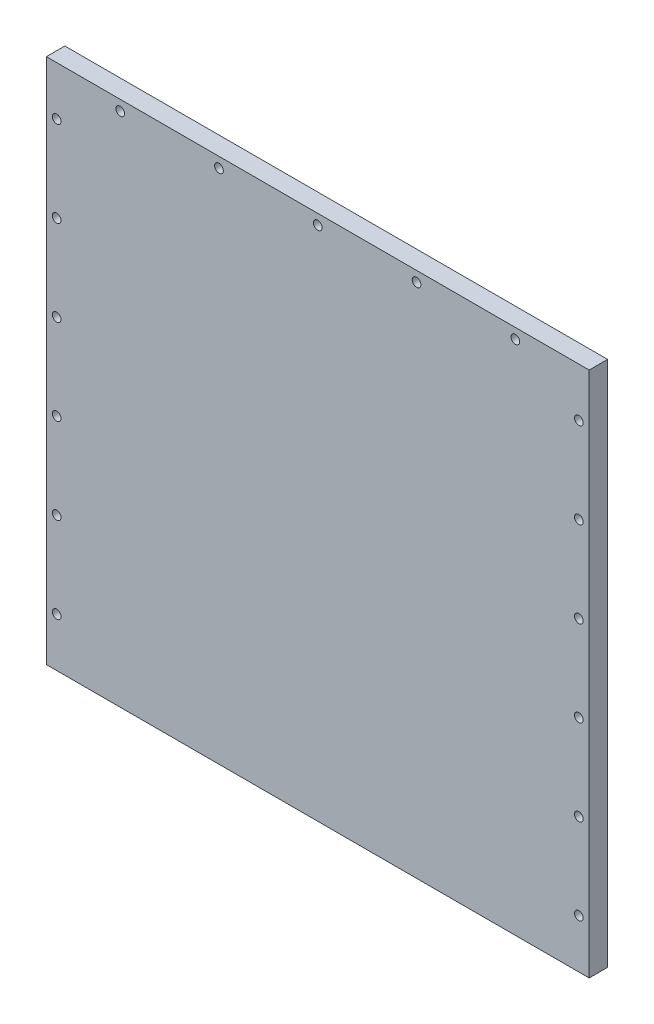
ISO-10303-21;
HEADER;
FILE_DESCRIPTION(('STEP AP214'),'2;1');
FILE_NAME('part.step','',(''),(''),'','','');
FILE_SCHEMA(('AUTOMOTIVE_DESIGN { 1 0 10303 214 1 1 1 1 }'));
ENDSEC;
DATA;
#1=APPLICATION_CONTEXT('core data for automotive mechanical design processes');
#2=APPLICATION_PROTOCOL_DEFINITION('international standard','automotive_design',2000,#1);
#3=PRODUCT_CONTEXT('',#1,'mechanical');
#4=PRODUCT('Part','Part','',(#3));
#5=PRODUCT_RELATED_PRODUCT_CATEGORY('part','',(#4));
#6=PRODUCT_DEFINITION_FORMATION('','',#4);
#7=PRODUCT_DEFINITION_CONTEXT('part definition',#1,'design');
#8=PRODUCT_DEFINITION('design','',#6,#7);
#9=PRODUCT_DEFINITION_SHAPE('','',#8);
#10=(LENGTH_UNIT() NAMED_UNIT(*) SI_UNIT(.MILLI.,.METRE.));
#11=(NAMED_UNIT(*) PLANE_ANGLE_UNIT() SI_UNIT($,.RADIAN.));
#12=(NAMED_UNIT(*) SI_UNIT($,.STERADIAN.) SOLID_ANGLE_UNIT());
#13=UNCERTAINTY_MEASURE_WITH_UNIT(LENGTH_MEASURE(1.E-05),#10,'distance_accuracy_value','');
#14=(GEOMETRIC_REPRESENTATION_CONTEXT(3) GLOBAL_UNCERTAINTY_ASSIGNED_CONTEXT((#13)) GLOBAL_UNIT_ASSIGNED_CONTEXT((#10,
#11,#12)) REPRESENTATION_CONTEXT('',''));
#15=CARTESIAN_POINT('',(0.,0.,0.));
#16=DIRECTION('',(0.,0.,1.));
#17=DIRECTION('',(1.,0.,0.));
#18=AXIS2_PLACEMENT_3D('',#15,#16,#17);
#19=CARTESIAN_POINT('',(0.,0.,17.));
#20=DIRECTION('',(0.,0.,1.));
#21=DIRECTION('',(1.,0.,0.));
#22=AXIS2_PLACEMENT_3D('',#19,#20,#21);
#23=PLANE('',#22);
#24=CARTESIAN_POINT('',(-91.,245.5,17.));
#25=DIRECTION('',(0.,0.,1.));
#26=DIRECTION('',(1.,0.,0.));
#27=AXIS2_PLACEMENT_3D('',#24,#25,#26);
#28=CIRCLE('',#27,3.99999999999999);
#29=CARTESIAN_POINT('',(-87.,245.5,17.));
#30=VERTEX_POINT('',#29);
#31=EDGE_CURVE('E167',#30,#30,#28,.F.);
#32=ORIENTED_EDGE('',*,*,#31,.T.);
#33=EDGE_LOOP('',(#32));
#34=FACE_BOUND('',#33,.T.);
#35=CARTESIAN_POINT('',(91.,245.5,17.));
#36=DIRECTION('',(0.,0.,1.));
#37=DIRECTION('',(1.,0.,0.));
#38=AXIS2_PLACEMENT_3D('',#35,#36,#37);
#39=CIRCLE('',#38,3.99999999999999);
#40=CARTESIAN_POINT('',(95.,245.5,17.));
#41=VERTEX_POINT('',#40);
#42=EDGE_CURVE('E160',#41,#41,#39,.F.);
#43=ORIENTED_EDGE('',*,*,#42,.T.);
#44=EDGE_LOOP('',(#43));
#45=FACE_BOUND('',#44,.T.);
#46=CARTESIAN_POINT('',(-182.,245.5,17.));
#47=DIRECTION('',(0.,0.,1.));
#48=DIRECTION('',(1.,0.,0.));
#49=AXIS2_PLACEMENT_3D('',#46,#47,#48);
#50=CIRCLE('',#49,3.99999999999999);
#51=CARTESIAN_POINT('',(-178.,245.5,17.));
#52=VERTEX_POINT('',#51);
#53=EDGE_CURVE('E152',#52,#52,#50,.F.);
#54=ORIENTED_EDGE('',*,*,#53,.T.);
#55=EDGE_LOOP('',(#54));
#56=FACE_BOUND('',#55,.T.);
#57=CARTESIAN_POINT('',(240.5,-106.,17.));
#58=DIRECTION('',(0.,0.,1.));
#59=DIRECTION('',(1.,0.,0.));
#60=AXIS2_PLACEMENT_3D('',#57,#58,#59);
#61=CIRCLE('',#60,3.99999999999999);
#62=CARTESIAN_POINT('',(244.5,-106.,17.));
#63=VERTEX_POINT('',#62);
#64=EDGE_CURVE('E144',#63,#63,#61,.F.);
#65=ORIENTED_EDGE('',*,*,#64,.T.);
#66=EDGE_LOOP('',(#65));
#67=FACE_BOUND('',#66,.T.);
#68=CARTESIAN_POINT('',(240.5,-27.,17.));
#69=DIRECTION('',(0.,0.,1.));
#70=DIRECTION('',(1.,0.,0.));
#71=AXIS2_PLACEMENT_3D('',#68,#69,#70);
#72=CIRCLE('',#71,3.99999999999999);
#73=CARTESIAN_POINT('',(244.5,-27.,17.));
#74=VERTEX_POINT('',#73);
#75=EDGE_CURVE('E136',#74,#74,#72,.F.);
#76=ORIENTED_EDGE('',*,*,#75,.T.);
#77=EDGE_LOOP('',(#76));
#78=FACE_BOUND('',#77,.T.);
#79=CARTESIAN_POINT('',(240.5,52.,17.));
#80=DIRECTION('',(0.,0.,1.));
#81=DIRECTION('',(1.,0.,0.));
#82=AXIS2_PLACEMENT_3D('',#79,#80,#81);
#83=CIRCLE('',#82,3.99999999999999);
#84=CARTESIAN_POINT('',(244.5,52.,17.));
#85=VERTEX_POINT('',#84);
#86=EDGE_CURVE('E128',#85,#85,#83,.F.);
#87=ORIENTED_EDGE('',*,*,#86,.T.);
#88=EDGE_LOOP('',(#87));
#89=FACE_BOUND('',#88,.T.);
#90=CARTESIAN_POINT('',(240.5,131.,17.));
#91=DIRECTION('',(0.,0.,1.));
#92=DIRECTION('',(1.,0.,0.));
#93=AXIS2_PLACEMENT_3D('',#90,#91,#92);
#94=CIRCLE('',#93,3.99999999999999);
#95=CARTESIAN_POINT('',(244.5,131.,17.));
#96=VERTEX_POINT('',#95);
#97=EDGE_CURVE('E120',#96,#96,#94,.F.);
#98=ORIENTED_EDGE('',*,*,#97,.T.);
#99=EDGE_LOOP('',(#98));
#100=FACE_BOUND('',#99,.T.);
#101=CARTESIAN_POINT('',(182.,245.5,17.));
#102=DIRECTION('',(0.,0.,1.));
#103=DIRECTION('',(1.,0.,0.));
#104=AXIS2_PLACEMENT_3D('',#101,#102,#103);
#105=CIRCLE('',#104,3.99999999999999);
#106=CARTESIAN_POINT('',(186.,245.5,17.));
#107=VERTEX_POINT('',#106);
#108=EDGE_CURVE('E112',#107,#107,#105,.F.);
#109=ORIENTED_EDGE('',*,*,#108,.T.);
#110=EDGE_LOOP('',(#109));
#111=FACE_BOUND('',#110,.T.);
#112=DIRECTION('',(0.,-1.,0.));
#113=VECTOR('',#112,1.);
#114=CARTESIAN_POINT('',(-250.,255.,17.));
#115=LINE('',#114,#113);
#116=CARTESIAN_POINT('',(-250.,255.,17.));
#117=VERTEX_POINT('',#116);
#118=CARTESIAN_POINT('',(-250.,-230.,17.));
#119=VERTEX_POINT('',#118);
#120=EDGE_CURVE('E87',#117,#119,#115,.T.);
#121=ORIENTED_EDGE('',*,*,#120,.T.);
#122=DIRECTION('',(1.,0.,0.));
#123=VECTOR('',#122,1.);
#124=CARTESIAN_POINT('',(-250.,-230.,17.));
#125=LINE('',#124,#123);
#126=CARTESIAN_POINT('',(250.,-230.,17.));
#127=VERTEX_POINT('',#126);
#128=EDGE_CURVE('E82',#119,#127,#125,.T.);
#129=ORIENTED_EDGE('',*,*,#128,.T.);
#130=DIRECTION('',(0.,1.,0.));
#131=VECTOR('',#130,1.);
#132=CARTESIAN_POINT('',(250.,255.,17.));
#133=LINE('',#132,#131);
#134=CARTESIAN_POINT('',(250.,255.,17.));
#135=VERTEX_POINT('',#134);
#136=EDGE_CURVE('E85',#127,#135,#133,.T.);
#137=ORIENTED_EDGE('',*,*,#136,.T.);
#138=DIRECTION('',(-1.,0.,0.));
#139=VECTOR('',#138,1.);
#140=CARTESIAN_POINT('',(-250.,255.,17.));
#141=LINE('',#140,#139);
#142=EDGE_CURVE('E52',#135,#117,#141,.T.);
#143=ORIENTED_EDGE('',*,*,#142,.T.);
#144=EDGE_LOOP('',(#121,#129,#137,#143));
#145=FACE_BOUND('',#144,.T.);
#146=CARTESIAN_POINT('',(240.5,210.,17.));
#147=DIRECTION('',(0.,0.,1.));
#148=DIRECTION('',(1.,0.,0.));
#149=AXIS2_PLACEMENT_3D('',#146,#147,#148);
#150=CIRCLE('',#149,3.99999999999999);
#151=CARTESIAN_POINT('',(244.5,210.,17.));
#152=VERTEX_POINT('',#151);
#153=EDGE_CURVE('E103',#152,#152,#150,.F.);
#154=ORIENTED_EDGE('',*,*,#153,.T.);
#155=EDGE_LOOP('',(#154));
#156=FACE_BOUND('',#155,.T.);
#157=CARTESIAN_POINT('',(-240.5,210.,17.));
#158=DIRECTION('',(0.,0.,1.));
#159=DIRECTION('',(1.,0.,0.));
#160=AXIS2_PLACEMENT_3D('',#157,#158,#159);
#161=CIRCLE('',#160,3.99999999999999);
#162=CARTESIAN_POINT('',(-236.5,210.,17.));
#163=VERTEX_POINT('',#162);
#164=EDGE_CURVE('E116',#163,#163,#161,.F.);
#165=ORIENTED_EDGE('',*,*,#164,.T.);
#166=EDGE_LOOP('',(#165));
#167=FACE_BOUND('',#166,.T.);
#168=CARTESIAN_POINT('',(-240.5,131.,17.));
#169=DIRECTION('',(0.,0.,1.));
#170=DIRECTION('',(1.,0.,0.));
#171=AXIS2_PLACEMENT_3D('',#168,#169,#170);
#172=CIRCLE('',#171,3.99999999999993);
#173=CARTESIAN_POINT('',(-236.5,131.,17.));
#174=VERTEX_POINT('',#173);
#175=EDGE_CURVE('E124',#174,#174,#172,.F.);
#176=ORIENTED_EDGE('',*,*,#175,.T.);
#177=EDGE_LOOP('',(#176));
#178=FACE_BOUND('',#177,.T.);
#179=CARTESIAN_POINT('',(-240.5,52.,17.));
#180=DIRECTION('',(0.,0.,1.));
#181=DIRECTION('',(1.,0.,0.));
#182=AXIS2_PLACEMENT_3D('',#179,#180,#181);
#183=CIRCLE('',#182,3.99999999999999);
#184=CARTESIAN_POINT('',(-236.5,52.,17.));
#185=VERTEX_POINT('',#184);
#186=EDGE_CURVE('E132',#185,#185,#183,.F.);
#187=ORIENTED_EDGE('',*,*,#186,.T.);
#188=EDGE_LOOP('',(#187));
#189=FACE_BOUND('',#188,.T.);
#190=CARTESIAN_POINT('',(-240.5,-27.,17.));
#191=DIRECTION('',(0.,0.,1.));
#192=DIRECTION('',(1.,0.,0.));
#193=AXIS2_PLACEMENT_3D('',#190,#191,#192);
#194=CIRCLE('',#193,3.99999999999999);
#195=CARTESIAN_POINT('',(-236.5,-27.,17.));
#196=VERTEX_POINT('',#195);
#197=EDGE_CURVE('E140',#196,#196,#194,.F.);
#198=ORIENTED_EDGE('',*,*,#197,.T.);
#199=EDGE_LOOP('',(#198));
#200=FACE_BOUND('',#199,.T.);
#201=CARTESIAN_POINT('',(-240.5,-106.,17.));
#202=DIRECTION('',(0.,0.,1.));
#203=DIRECTION('',(1.,0.,0.));
#204=AXIS2_PLACEMENT_3D('',#201,#202,#203);
#205=CIRCLE('',#204,3.99999999999999);
#206=CARTESIAN_POINT('',(-236.5,-106.,17.));
#207=VERTEX_POINT('',#206);
#208=EDGE_CURVE('E148',#207,#207,#205,.F.);
#209=ORIENTED_EDGE('',*,*,#208,.T.);
#210=EDGE_LOOP('',(#209));
#211=FACE_BOUND('',#210,.T.);
#212=CARTESIAN_POINT('',(240.5,-185.,17.));
#213=DIRECTION('',(0.,0.,1.));
#214=DIRECTION('',(1.,0.,0.));
#215=AXIS2_PLACEMENT_3D('',#212,#213,#214);
#216=CIRCLE('',#215,3.99999999999999);
#217=CARTESIAN_POINT('',(244.5,-185.,17.));
#218=VERTEX_POINT('',#217);
#219=EDGE_CURVE('E156',#218,#218,#216,.F.);
#220=ORIENTED_EDGE('',*,*,#219,.T.);
#221=EDGE_LOOP('',(#220));
#222=FACE_BOUND('',#221,.T.);
#223=CARTESIAN_POINT('',(0.,245.5,17.));
#224=DIRECTION('',(0.,0.,1.));
#225=DIRECTION('',(1.,0.,0.));
#226=AXIS2_PLACEMENT_3D('',#223,#224,#225);
#227=CIRCLE('',#226,4.00000000000001);
#228=CARTESIAN_POINT('',(4.00000000000001,245.5,17.));
#229=VERTEX_POINT('',#228);
#230=EDGE_CURVE('E164',#229,#229,#227,.F.);
#231=ORIENTED_EDGE('',*,*,#230,.T.);
#232=EDGE_LOOP('',(#231));
#233=FACE_BOUND('',#232,.T.);
#234=CARTESIAN_POINT('',(-240.5,-185.,17.));
#235=DIRECTION('',(0.,0.,1.));
#236=DIRECTION('',(1.,0.,0.));
#237=AXIS2_PLACEMENT_3D('',#234,#235,#236);
#238=CIRCLE('',#237,3.99999999999999);
#239=CARTESIAN_POINT('',(-236.5,-185.,17.));
#240=VERTEX_POINT('',#239);
#241=EDGE_CURVE('E37',#240,#240,#238,.F.);
#242=ORIENTED_EDGE('',*,*,#241,.T.);
#243=EDGE_LOOP('',(#242));
#244=FACE_BOUND('',#243,.T.);
#245=ADVANCED_FACE('F33',(#34,#45,#56,#67,#78,#89,#100,#111,#145,#156,#167,#178,#189,#200,#211,
#222,#233,#244),#23,.T.);
#246=CARTESIAN_POINT('',(-250.,255.,17.));
#247=DIRECTION('',(1.,0.,0.));
#248=DIRECTION('',(0.,1.,0.));
#249=AXIS2_PLACEMENT_3D('',#246,#247,#248);
#250=PLANE('',#249);
#251=DIRECTION('',(0.,-1.,0.));
#252=VECTOR('',#251,1.);
#253=CARTESIAN_POINT('',(-250.,255.,0.));
#254=LINE('',#253,#252);
#255=CARTESIAN_POINT('',(-250.,255.,0.));
#256=VERTEX_POINT('',#255);
#257=CARTESIAN_POINT('',(-250.,-230.,0.));
#258=VERTEX_POINT('',#257);
#259=EDGE_CURVE('E100',#256,#258,#254,.T.);
#260=ORIENTED_EDGE('',*,*,#259,.T.);
#261=DIRECTION('',(0.,0.,-1.));
#262=VECTOR('',#261,1.);
#263=CARTESIAN_POINT('',(-250.,-230.,17.));
#264=LINE('',#263,#262);
#265=EDGE_CURVE('E11',#119,#258,#264,.T.);
#266=ORIENTED_EDGE('',*,*,#265,.F.);
#267=ORIENTED_EDGE('',*,*,#120,.F.);
#268=DIRECTION('',(0.,0.,-1.));
#269=VECTOR('',#268,1.);
#270=CARTESIAN_POINT('',(-250.,255.,17.));
#271=LINE('',#270,#269);
#272=EDGE_CURVE('E96',#117,#256,#271,.T.);
#273=ORIENTED_EDGE('',*,*,#272,.T.);
#274=EDGE_LOOP('',(#260,#266,#267,#273));
#275=FACE_BOUND('',#274,.T.);
#276=ADVANCED_FACE('F35',(#275),#250,.F.);
#277=CARTESIAN_POINT('',(-250.,-230.,17.));
#278=DIRECTION('',(0.,1.,0.));
#279=DIRECTION('',(0.,0.,1.));
#280=AXIS2_PLACEMENT_3D('',#277,#278,#279);
#281=PLANE('',#280);
#282=DIRECTION('',(1.,0.,0.));
#283=VECTOR('',#282,1.);
#284=CARTESIAN_POINT('',(-250.,-230.,0.));
#285=LINE('',#284,#283);
#286=CARTESIAN_POINT('',(250.,-230.,0.));
#287=VERTEX_POINT('',#286);
#288=EDGE_CURVE('E91',#258,#287,#285,.T.);
#289=ORIENTED_EDGE('',*,*,#288,.T.);
#290=DIRECTION('',(0.,0.,-1.));
#291=VECTOR('',#290,1.);
#292=CARTESIAN_POINT('',(250.,-230.,17.));
#293=LINE('',#292,#291);
#294=EDGE_CURVE('E43',#127,#287,#293,.T.);
#295=ORIENTED_EDGE('',*,*,#294,.F.);
#296=ORIENTED_EDGE('',*,*,#128,.F.);
#297=ORIENTED_EDGE('',*,*,#265,.T.);
#298=EDGE_LOOP('',(#289,#295,#296,#297));
#299=FACE_BOUND('',#298,.T.);
#300=ADVANCED_FACE('F90',(#299),#281,.F.);
#301=CARTESIAN_POINT('',(250.,255.,17.));
#302=DIRECTION('',(-1.,0.,0.));
#303=DIRECTION('',(0.,0.,1.));
#304=AXIS2_PLACEMENT_3D('',#301,#302,#303);
#305=PLANE('',#304);
#306=DIRECTION('',(0.,1.,0.));
#307=VECTOR('',#306,1.);
#308=CARTESIAN_POINT('',(250.,255.,0.));
#309=LINE('',#308,#307);
#310=CARTESIAN_POINT('',(250.,255.,0.));
#311=VERTEX_POINT('',#310);
#312=EDGE_CURVE('E69',#287,#311,#309,.T.);
#313=ORIENTED_EDGE('',*,*,#312,.T.);
#314=DIRECTION('',(0.,0.,-1.));
#315=VECTOR('',#314,1.);
#316=CARTESIAN_POINT('',(250.,255.,17.));
#317=LINE('',#316,#315);
#318=EDGE_CURVE('E92',#135,#311,#317,.T.);
#319=ORIENTED_EDGE('',*,*,#318,.F.);
#320=ORIENTED_EDGE('',*,*,#136,.F.);
#321=ORIENTED_EDGE('',*,*,#294,.T.);
#322=EDGE_LOOP('',(#313,#319,#320,#321));
#323=FACE_BOUND('',#322,.T.);
#324=ADVANCED_FACE('F94',(#323),#305,.F.);
#325=CARTESIAN_POINT('',(-250.,255.,17.));
#326=DIRECTION('',(0.,-1.,0.));
#327=DIRECTION('',(0.,0.,-1.));
#328=AXIS2_PLACEMENT_3D('',#325,#326,#327);
#329=PLANE('',#328);
#330=DIRECTION('',(-1.,0.,0.));
#331=VECTOR('',#330,1.);
#332=CARTESIAN_POINT('',(-250.,255.,0.));
#333=LINE('',#332,#331);
#334=EDGE_CURVE('E75',#311,#256,#333,.T.);
#335=ORIENTED_EDGE('',*,*,#334,.T.);
#336=ORIENTED_EDGE('',*,*,#272,.F.);
#337=ORIENTED_EDGE('',*,*,#142,.F.);
#338=ORIENTED_EDGE('',*,*,#318,.T.);
#339=EDGE_LOOP('',(#335,#336,#337,#338));
#340=FACE_BOUND('',#339,.T.);
#341=ADVANCED_FACE('F224',(#340),#329,.F.);
#342=CARTESIAN_POINT('',(0.,0.,0.));
#343=DIRECTION('',(0.,0.,1.));
#344=DIRECTION('',(1.,0.,0.));
#345=AXIS2_PLACEMENT_3D('',#342,#343,#344);
#346=PLANE('',#345);
#347=ORIENTED_EDGE('',*,*,#259,.F.);
#348=ORIENTED_EDGE('',*,*,#334,.F.);
#349=ORIENTED_EDGE('',*,*,#312,.F.);
#350=ORIENTED_EDGE('',*,*,#288,.F.);
#351=EDGE_LOOP('',(#347,#348,#349,#350));
#352=FACE_BOUND('',#351,.T.);
#353=ADVANCED_FACE('F215',(#352),#346,.F.);
#354=CARTESIAN_POINT('',(240.5,210.,42.));
#355=DIRECTION('',(0.,0.,-1.));
#356=DIRECTION('',(-1.,0.,0.));
#357=AXIS2_PLACEMENT_3D('',#354,#355,#356);
#358=CYLINDRICAL_SURFACE('',#357,3.99999999999999);
#359=ORIENTED_EDGE('',*,*,#153,.F.);
#360=EDGE_LOOP('',(#359));
#361=FACE_BOUND('',#360,.T.);
#362=CARTESIAN_POINT('',(240.5,210.,4.));
#363=DIRECTION('',(0.,0.,1.));
#364=DIRECTION('',(1.,0.,0.));
#365=AXIS2_PLACEMENT_3D('',#362,#363,#364);
#366=CIRCLE('',#365,3.99999999999999);
#367=CARTESIAN_POINT('',(244.5,210.,4.));
#368=VERTEX_POINT('',#367);
#369=EDGE_CURVE('E111',#368,#368,#366,.T.);
#370=ORIENTED_EDGE('',*,*,#369,.F.);
#371=EDGE_LOOP('',(#370));
#372=FACE_BOUND('',#371,.T.);
#373=ADVANCED_FACE('F213',(#361,#372),#358,.F.);
#374=CARTESIAN_POINT('',(240.5,210.,4.));
#375=DIRECTION('',(0.,0.,1.));
#376=DIRECTION('',(1.,0.,0.));
#377=AXIS2_PLACEMENT_3D('',#374,#375,#376);
#378=PLANE('',#377);
#379=ORIENTED_EDGE('',*,*,#369,.T.);
#380=EDGE_LOOP('',(#379));
#381=FACE_BOUND('',#380,.T.);
#382=ADVANCED_FACE('F211',(#381),#378,.T.);
#383=CARTESIAN_POINT('',(182.,245.5,42.));
#384=DIRECTION('',(0.,0.,-1.));
#385=DIRECTION('',(-1.,0.,0.));
#386=AXIS2_PLACEMENT_3D('',#383,#384,#385);
#387=CYLINDRICAL_SURFACE('',#386,3.99999999999999);
#388=ORIENTED_EDGE('',*,*,#108,.F.);
#389=EDGE_LOOP('',(#388));
#390=FACE_BOUND('',#389,.T.);
#391=CARTESIAN_POINT('',(182.,245.5,4.));
#392=DIRECTION('',(0.,0.,1.));
#393=DIRECTION('',(1.,0.,0.));
#394=AXIS2_PLACEMENT_3D('',#391,#392,#393);
#395=CIRCLE('',#394,3.99999999999999);
#396=CARTESIAN_POINT('',(186.,245.5,4.));
#397=VERTEX_POINT('',#396);
#398=EDGE_CURVE('E115',#397,#397,#395,.T.);
#399=ORIENTED_EDGE('',*,*,#398,.F.);
#400=EDGE_LOOP('',(#399));
#401=FACE_BOUND('',#400,.T.);
#402=ADVANCED_FACE('F222',(#390,#401),#387,.F.);
#403=CARTESIAN_POINT('',(182.,245.5,4.));
#404=DIRECTION('',(0.,0.,1.));
#405=DIRECTION('',(1.,0.,0.));
#406=AXIS2_PLACEMENT_3D('',#403,#404,#405);
#407=PLANE('',#406);
#408=ORIENTED_EDGE('',*,*,#398,.T.);
#409=EDGE_LOOP('',(#408));
#410=FACE_BOUND('',#409,.T.);
#411=ADVANCED_FACE('F279',(#410),#407,.T.);
#412=CARTESIAN_POINT('',(-240.5,210.,42.));
#413=DIRECTION('',(0.,0.,-1.));
#414=DIRECTION('',(-1.,0.,0.));
#415=AXIS2_PLACEMENT_3D('',#412,#413,#414);
#416=CYLINDRICAL_SURFACE('',#415,3.99999999999999);
#417=ORIENTED_EDGE('',*,*,#164,.F.);
#418=EDGE_LOOP('',(#417));
#419=FACE_BOUND('',#418,.T.);
#420=CARTESIAN_POINT('',(-240.5,210.,4.));
#421=DIRECTION('',(0.,0.,1.));
#422=DIRECTION('',(1.,0.,0.));
#423=AXIS2_PLACEMENT_3D('',#420,#421,#422);
#424=CIRCLE('',#423,3.99999999999999);
#425=CARTESIAN_POINT('',(-236.5,210.,4.));
#426=VERTEX_POINT('',#425);
#427=EDGE_CURVE('E119',#426,#426,#424,.T.);
#428=ORIENTED_EDGE('',*,*,#427,.F.);
#429=EDGE_LOOP('',(#428));
#430=FACE_BOUND('',#429,.T.);
#431=ADVANCED_FACE('F289',(#419,#430),#416,.F.);
#432=CARTESIAN_POINT('',(-240.5,210.,4.));
#433=DIRECTION('',(0.,0.,1.));
#434=DIRECTION('',(1.,0.,0.));
#435=AXIS2_PLACEMENT_3D('',#432,#433,#434);
#436=PLANE('',#435);
#437=ORIENTED_EDGE('',*,*,#427,.T.);
#438=EDGE_LOOP('',(#437));
#439=FACE_BOUND('',#438,.T.);
#440=ADVANCED_FACE('F299',(#439),#436,.T.);
#441=CARTESIAN_POINT('',(240.5,131.,42.));
#442=DIRECTION('',(0.,0.,-1.));
#443=DIRECTION('',(-1.,0.,0.));
#444=AXIS2_PLACEMENT_3D('',#441,#442,#443);
#445=CYLINDRICAL_SURFACE('',#444,3.99999999999999);
#446=ORIENTED_EDGE('',*,*,#97,.F.);
#447=EDGE_LOOP('',(#446));
#448=FACE_BOUND('',#447,.T.);
#449=CARTESIAN_POINT('',(240.5,131.,4.));
#450=DIRECTION('',(0.,0.,1.));
#451=DIRECTION('',(1.,0.,0.));
#452=AXIS2_PLACEMENT_3D('',#449,#450,#451);
#453=CIRCLE('',#452,3.99999999999999);
#454=CARTESIAN_POINT('',(244.5,131.,4.));
#455=VERTEX_POINT('',#454);
#456=EDGE_CURVE('E123',#455,#455,#453,.T.);
#457=ORIENTED_EDGE('',*,*,#456,.F.);
#458=EDGE_LOOP('',(#457));
#459=FACE_BOUND('',#458,.T.);
#460=ADVANCED_FACE('F309',(#448,#459),#445,.F.);
#461=CARTESIAN_POINT('',(240.5,131.,4.));
#462=DIRECTION('',(0.,0.,1.));
#463=DIRECTION('',(1.,0.,0.));
#464=AXIS2_PLACEMENT_3D('',#461,#462,#463);
#465=PLANE('',#464);
#466=ORIENTED_EDGE('',*,*,#456,.T.);
#467=EDGE_LOOP('',(#466));
#468=FACE_BOUND('',#467,.T.);
#469=ADVANCED_FACE('F319',(#468),#465,.T.);
#470=CARTESIAN_POINT('',(-240.5,131.,42.));
#471=DIRECTION('',(0.,0.,-1.));
#472=DIRECTION('',(-1.,0.,0.));
#473=AXIS2_PLACEMENT_3D('',#470,#471,#472);
#474=CYLINDRICAL_SURFACE('',#473,3.99999999999993);
#475=ORIENTED_EDGE('',*,*,#175,.F.);
#476=EDGE_LOOP('',(#475));
#477=FACE_BOUND('',#476,.T.);
#478=CARTESIAN_POINT('',(-240.5,131.,4.));
#479=DIRECTION('',(0.,0.,1.));
#480=DIRECTION('',(1.,0.,0.));
#481=AXIS2_PLACEMENT_3D('',#478,#479,#480);
#482=CIRCLE('',#481,3.99999999999993);
#483=CARTESIAN_POINT('',(-236.5,131.,4.));
#484=VERTEX_POINT('',#483);
#485=EDGE_CURVE('E127',#484,#484,#482,.T.);
#486=ORIENTED_EDGE('',*,*,#485,.F.);
#487=EDGE_LOOP('',(#486));
#488=FACE_BOUND('',#487,.T.);
#489=ADVANCED_FACE('F329',(#477,#488),#474,.F.);
#490=CARTESIAN_POINT('',(-240.5,131.,4.));
#491=DIRECTION('',(0.,0.,1.));
#492=DIRECTION('',(1.,0.,0.));
#493=AXIS2_PLACEMENT_3D('',#490,#491,#492);
#494=PLANE('',#493);
#495=ORIENTED_EDGE('',*,*,#485,.T.);
#496=EDGE_LOOP('',(#495));
#497=FACE_BOUND('',#496,.T.);
#498=ADVANCED_FACE('F339',(#497),#494,.T.);
#499=CARTESIAN_POINT('',(240.5,52.,42.));
#500=DIRECTION('',(0.,0.,-1.));
#501=DIRECTION('',(-1.,0.,0.));
#502=AXIS2_PLACEMENT_3D('',#499,#500,#501);
#503=CYLINDRICAL_SURFACE('',#502,3.99999999999999);
#504=ORIENTED_EDGE('',*,*,#86,.F.);
#505=EDGE_LOOP('',(#504));
#506=FACE_BOUND('',#505,.T.);
#507=CARTESIAN_POINT('',(240.5,52.,4.));
#508=DIRECTION('',(0.,0.,1.));
#509=DIRECTION('',(1.,0.,0.));
#510=AXIS2_PLACEMENT_3D('',#507,#508,#509);
#511=CIRCLE('',#510,3.99999999999999);
#512=CARTESIAN_POINT('',(244.5,52.,4.));
#513=VERTEX_POINT('',#512);
#514=EDGE_CURVE('E131',#513,#513,#511,.T.);
#515=ORIENTED_EDGE('',*,*,#514,.F.);
#516=EDGE_LOOP('',(#515));
#517=FACE_BOUND('',#516,.T.);
#518=ADVANCED_FACE('F349',(#506,#517),#503,.F.);
#519=CARTESIAN_POINT('',(240.5,52.,4.));
#520=DIRECTION('',(0.,0.,1.));
#521=DIRECTION('',(1.,0.,0.));
#522=AXIS2_PLACEMENT_3D('',#519,#520,#521);
#523=PLANE('',#522);
#524=ORIENTED_EDGE('',*,*,#514,.T.);
#525=EDGE_LOOP('',(#524));
#526=FACE_BOUND('',#525,.T.);
#527=ADVANCED_FACE('F359',(#526),#523,.T.);
#528=CARTESIAN_POINT('',(-240.5,52.,42.));
#529=DIRECTION('',(0.,0.,-1.));
#530=DIRECTION('',(-1.,0.,0.));
#531=AXIS2_PLACEMENT_3D('',#528,#529,#530);
#532=CYLINDRICAL_SURFACE('',#531,3.99999999999999);
#533=ORIENTED_EDGE('',*,*,#186,.F.);
#534=EDGE_LOOP('',(#533));
#535=FACE_BOUND('',#534,.T.);
#536=CARTESIAN_POINT('',(-240.5,52.,4.));
#537=DIRECTION('',(0.,0.,1.));
#538=DIRECTION('',(1.,0.,0.));
#539=AXIS2_PLACEMENT_3D('',#536,#537,#538);
#540=CIRCLE('',#539,3.99999999999999);
#541=CARTESIAN_POINT('',(-236.5,52.,4.));
#542=VERTEX_POINT('',#541);
#543=EDGE_CURVE('E135',#542,#542,#540,.T.);
#544=ORIENTED_EDGE('',*,*,#543,.F.);
#545=EDGE_LOOP('',(#544));
#546=FACE_BOUND('',#545,.T.);
#547=ADVANCED_FACE('F369',(#535,#546),#532,.F.);
#548=CARTESIAN_POINT('',(-240.5,52.,4.));
#549=DIRECTION('',(0.,0.,1.));
#550=DIRECTION('',(1.,0.,0.));
#551=AXIS2_PLACEMENT_3D('',#548,#549,#550);
#552=PLANE('',#551);
#553=ORIENTED_EDGE('',*,*,#543,.T.);
#554=EDGE_LOOP('',(#553));
#555=FACE_BOUND('',#554,.T.);
#556=ADVANCED_FACE('F379',(#555),#552,.T.);
#557=CARTESIAN_POINT('',(240.5,-27.,42.));
#558=DIRECTION('',(0.,0.,-1.));
#559=DIRECTION('',(-1.,0.,0.));
#560=AXIS2_PLACEMENT_3D('',#557,#558,#559);
#561=CYLINDRICAL_SURFACE('',#560,3.99999999999999);
#562=ORIENTED_EDGE('',*,*,#75,.F.);
#563=EDGE_LOOP('',(#562));
#564=FACE_BOUND('',#563,.T.);
#565=CARTESIAN_POINT('',(240.5,-27.,4.));
#566=DIRECTION('',(0.,0.,1.));
#567=DIRECTION('',(1.,0.,0.));
#568=AXIS2_PLACEMENT_3D('',#565,#566,#567);
#569=CIRCLE('',#568,3.99999999999999);
#570=CARTESIAN_POINT('',(244.5,-27.,4.));
#571=VERTEX_POINT('',#570);
#572=EDGE_CURVE('E139',#571,#571,#569,.T.);
#573=ORIENTED_EDGE('',*,*,#572,.F.);
#574=EDGE_LOOP('',(#573));
#575=FACE_BOUND('',#574,.T.);
#576=ADVANCED_FACE('F389',(#564,#575),#561,.F.);
#577=CARTESIAN_POINT('',(240.5,-27.,4.));
#578=DIRECTION('',(0.,0.,1.));
#579=DIRECTION('',(1.,0.,0.));
#580=AXIS2_PLACEMENT_3D('',#577,#578,#579);
#581=PLANE('',#580);
#582=ORIENTED_EDGE('',*,*,#572,.T.);
#583=EDGE_LOOP('',(#582));
#584=FACE_BOUND('',#583,.T.);
#585=ADVANCED_FACE('F399',(#584),#581,.T.);
#586=CARTESIAN_POINT('',(-240.5,-27.,42.));
#587=DIRECTION('',(0.,0.,-1.));
#588=DIRECTION('',(-1.,0.,0.));
#589=AXIS2_PLACEMENT_3D('',#586,#587,#588);
#590=CYLINDRICAL_SURFACE('',#589,3.99999999999999);
#591=ORIENTED_EDGE('',*,*,#197,.F.);
#592=EDGE_LOOP('',(#591));
#593=FACE_BOUND('',#592,.T.);
#594=CARTESIAN_POINT('',(-240.5,-27.,4.));
#595=DIRECTION('',(0.,0.,1.));
#596=DIRECTION('',(1.,0.,0.));
#597=AXIS2_PLACEMENT_3D('',#594,#595,#596);
#598=CIRCLE('',#597,3.99999999999999);
#599=CARTESIAN_POINT('',(-236.5,-27.,4.));
#600=VERTEX_POINT('',#599);
#601=EDGE_CURVE('E143',#600,#600,#598,.T.);
#602=ORIENTED_EDGE('',*,*,#601,.F.);
#603=EDGE_LOOP('',(#602));
#604=FACE_BOUND('',#603,.T.);
#605=ADVANCED_FACE('F409',(#593,#604),#590,.F.);
#606=CARTESIAN_POINT('',(-240.5,-27.,4.));
#607=DIRECTION('',(0.,0.,1.));
#608=DIRECTION('',(1.,0.,0.));
#609=AXIS2_PLACEMENT_3D('',#606,#607,#608);
#610=PLANE('',#609);
#611=ORIENTED_EDGE('',*,*,#601,.T.);
#612=EDGE_LOOP('',(#611));
#613=FACE_BOUND('',#612,.T.);
#614=ADVANCED_FACE('F419',(#613),#610,.T.);
#615=CARTESIAN_POINT('',(240.5,-106.,42.));
#616=DIRECTION('',(0.,0.,-1.));
#617=DIRECTION('',(-1.,0.,0.));
#618=AXIS2_PLACEMENT_3D('',#615,#616,#617);
#619=CYLINDRICAL_SURFACE('',#618,3.99999999999999);
#620=ORIENTED_EDGE('',*,*,#64,.F.);
#621=EDGE_LOOP('',(#620));
#622=FACE_BOUND('',#621,.T.);
#623=CARTESIAN_POINT('',(240.5,-106.,4.));
#624=DIRECTION('',(0.,0.,1.));
#625=DIRECTION('',(1.,0.,0.));
#626=AXIS2_PLACEMENT_3D('',#623,#624,#625);
#627=CIRCLE('',#626,3.99999999999999);
#628=CARTESIAN_POINT('',(244.5,-106.,4.));
#629=VERTEX_POINT('',#628);
#630=EDGE_CURVE('E147',#629,#629,#627,.T.);
#631=ORIENTED_EDGE('',*,*,#630,.F.);
#632=EDGE_LOOP('',(#631));
#633=FACE_BOUND('',#632,.T.);
#634=ADVANCED_FACE('F429',(#622,#633),#619,.F.);
#635=CARTESIAN_POINT('',(240.5,-106.,4.));
#636=DIRECTION('',(0.,0.,1.));
#637=DIRECTION('',(1.,0.,0.));
#638=AXIS2_PLACEMENT_3D('',#635,#636,#637);
#639=PLANE('',#638);
#640=ORIENTED_EDGE('',*,*,#630,.T.);
#641=EDGE_LOOP('',(#640));
#642=FACE_BOUND('',#641,.T.);
#643=ADVANCED_FACE('F439',(#642),#639,.T.);
#644=CARTESIAN_POINT('',(-240.5,-106.,42.));
#645=DIRECTION('',(0.,0.,-1.));
#646=DIRECTION('',(-1.,0.,0.));
#647=AXIS2_PLACEMENT_3D('',#644,#645,#646);
#648=CYLINDRICAL_SURFACE('',#647,3.99999999999999);
#649=ORIENTED_EDGE('',*,*,#208,.F.);
#650=EDGE_LOOP('',(#649));
#651=FACE_BOUND('',#650,.T.);
#652=CARTESIAN_POINT('',(-240.5,-106.,4.));
#653=DIRECTION('',(0.,0.,1.));
#654=DIRECTION('',(1.,0.,0.));
#655=AXIS2_PLACEMENT_3D('',#652,#653,#654);
#656=CIRCLE('',#655,3.99999999999999);
#657=CARTESIAN_POINT('',(-236.5,-106.,4.));
#658=VERTEX_POINT('',#657);
#659=EDGE_CURVE('E151',#658,#658,#656,.T.);
#660=ORIENTED_EDGE('',*,*,#659,.F.);
#661=EDGE_LOOP('',(#660));
#662=FACE_BOUND('',#661,.T.);
#663=ADVANCED_FACE('F449',(#651,#662),#648,.F.);
#664=CARTESIAN_POINT('',(-240.5,-106.,4.));
#665=DIRECTION('',(0.,0.,1.));
#666=DIRECTION('',(1.,0.,0.));
#667=AXIS2_PLACEMENT_3D('',#664,#665,#666);
#668=PLANE('',#667);
#669=ORIENTED_EDGE('',*,*,#659,.T.);
#670=EDGE_LOOP('',(#669));
#671=FACE_BOUND('',#670,.T.);
#672=ADVANCED_FACE('F459',(#671),#668,.T.);
#673=CARTESIAN_POINT('',(-182.,245.5,42.));
#674=DIRECTION('',(0.,0.,-1.));
#675=DIRECTION('',(-1.,0.,0.));
#676=AXIS2_PLACEMENT_3D('',#673,#674,#675);
#677=CYLINDRICAL_SURFACE('',#676,3.99999999999999);
#678=ORIENTED_EDGE('',*,*,#53,.F.);
#679=EDGE_LOOP('',(#678));
#680=FACE_BOUND('',#679,.T.);
#681=CARTESIAN_POINT('',(-182.,245.5,4.));
#682=DIRECTION('',(0.,0.,1.));
#683=DIRECTION('',(1.,0.,0.));
#684=AXIS2_PLACEMENT_3D('',#681,#682,#683);
#685=CIRCLE('',#684,3.99999999999999);
#686=CARTESIAN_POINT('',(-178.,245.5,4.));
#687=VERTEX_POINT('',#686);
#688=EDGE_CURVE('E155',#687,#687,#685,.T.);
#689=ORIENTED_EDGE('',*,*,#688,.F.);
#690=EDGE_LOOP('',(#689));
#691=FACE_BOUND('',#690,.T.);
#692=ADVANCED_FACE('F469',(#680,#691),#677,.F.);
#693=CARTESIAN_POINT('',(-182.,245.5,4.));
#694=DIRECTION('',(0.,0.,1.));
#695=DIRECTION('',(1.,0.,0.));
#696=AXIS2_PLACEMENT_3D('',#693,#694,#695);
#697=PLANE('',#696);
#698=ORIENTED_EDGE('',*,*,#688,.T.);
#699=EDGE_LOOP('',(#698));
#700=FACE_BOUND('',#699,.T.);
#701=ADVANCED_FACE('F479',(#700),#697,.T.);
#702=CARTESIAN_POINT('',(240.5,-185.,42.));
#703=DIRECTION('',(0.,0.,-1.));
#704=DIRECTION('',(-1.,0.,0.));
#705=AXIS2_PLACEMENT_3D('',#702,#703,#704);
#706=CYLINDRICAL_SURFACE('',#705,3.99999999999999);
#707=ORIENTED_EDGE('',*,*,#219,.F.);
#708=EDGE_LOOP('',(#707));
#709=FACE_BOUND('',#708,.T.);
#710=CARTESIAN_POINT('',(240.5,-185.,4.));
#711=DIRECTION('',(0.,0.,1.));
#712=DIRECTION('',(1.,0.,0.));
#713=AXIS2_PLACEMENT_3D('',#710,#711,#712);
#714=CIRCLE('',#713,3.99999999999999);
#715=CARTESIAN_POINT('',(244.5,-185.,4.));
#716=VERTEX_POINT('',#715);
#717=EDGE_CURVE('E159',#716,#716,#714,.T.);
#718=ORIENTED_EDGE('',*,*,#717,.F.);
#719=EDGE_LOOP('',(#718));
#720=FACE_BOUND('',#719,.T.);
#721=ADVANCED_FACE('F489',(#709,#720),#706,.F.);
#722=CARTESIAN_POINT('',(240.5,-185.,4.));
#723=DIRECTION('',(0.,0.,1.));
#724=DIRECTION('',(1.,0.,0.));
#725=AXIS2_PLACEMENT_3D('',#722,#723,#724);
#726=PLANE('',#725);
#727=ORIENTED_EDGE('',*,*,#717,.T.);
#728=EDGE_LOOP('',(#727));
#729=FACE_BOUND('',#728,.T.);
#730=ADVANCED_FACE('F499',(#729),#726,.T.);
#731=CARTESIAN_POINT('',(91.,245.5,42.));
#732=DIRECTION('',(0.,0.,-1.));
#733=DIRECTION('',(-1.,0.,0.));
#734=AXIS2_PLACEMENT_3D('',#731,#732,#733);
#735=CYLINDRICAL_SURFACE('',#734,3.99999999999999);
#736=ORIENTED_EDGE('',*,*,#42,.F.);
#737=EDGE_LOOP('',(#736));
#738=FACE_BOUND('',#737,.T.);
#739=CARTESIAN_POINT('',(91.,245.5,4.));
#740=DIRECTION('',(0.,0.,1.));
#741=DIRECTION('',(1.,0.,0.));
#742=AXIS2_PLACEMENT_3D('',#739,#740,#741);
#743=CIRCLE('',#742,3.99999999999999);
#744=CARTESIAN_POINT('',(95.,245.5,4.));
#745=VERTEX_POINT('',#744);
#746=EDGE_CURVE('E163',#745,#745,#743,.T.);
#747=ORIENTED_EDGE('',*,*,#746,.F.);
#748=EDGE_LOOP('',(#747));
#749=FACE_BOUND('',#748,.T.);
#750=ADVANCED_FACE('F509',(#738,#749),#735,.F.);
#751=CARTESIAN_POINT('',(91.,245.5,4.));
#752=DIRECTION('',(0.,0.,1.));
#753=DIRECTION('',(1.,0.,0.));
#754=AXIS2_PLACEMENT_3D('',#751,#752,#753);
#755=PLANE('',#754);
#756=ORIENTED_EDGE('',*,*,#746,.T.);
#757=EDGE_LOOP('',(#756));
#758=FACE_BOUND('',#757,.T.);
#759=ADVANCED_FACE('F519',(#758),#755,.T.);
#760=CARTESIAN_POINT('',(0.,245.5,42.));
#761=DIRECTION('',(0.,0.,-1.));
#762=DIRECTION('',(-1.,0.,0.));
#763=AXIS2_PLACEMENT_3D('',#760,#761,#762);
#764=CYLINDRICAL_SURFACE('',#763,4.00000000000001);
#765=ORIENTED_EDGE('',*,*,#230,.F.);
#766=EDGE_LOOP('',(#765));
#767=FACE_BOUND('',#766,.T.);
#768=CARTESIAN_POINT('',(0.,245.5,4.));
#769=DIRECTION('',(0.,0.,1.));
#770=DIRECTION('',(1.,0.,0.));
#771=AXIS2_PLACEMENT_3D('',#768,#769,#770);
#772=CIRCLE('',#771,4.00000000000001);
#773=CARTESIAN_POINT('',(4.00000000000001,245.5,4.));
#774=VERTEX_POINT('',#773);
#775=EDGE_CURVE('E166',#774,#774,#772,.T.);
#776=ORIENTED_EDGE('',*,*,#775,.F.);
#777=EDGE_LOOP('',(#776));
#778=FACE_BOUND('',#777,.T.);
#779=ADVANCED_FACE('F529',(#767,#778),#764,.F.);
#780=CARTESIAN_POINT('',(0.,245.5,4.));
#781=DIRECTION('',(0.,0.,1.));
#782=DIRECTION('',(1.,0.,0.));
#783=AXIS2_PLACEMENT_3D('',#780,#781,#782);
#784=PLANE('',#783);
#785=ORIENTED_EDGE('',*,*,#775,.T.);
#786=EDGE_LOOP('',(#785));
#787=FACE_BOUND('',#786,.T.);
#788=ADVANCED_FACE('F539',(#787),#784,.T.);
#789=CARTESIAN_POINT('',(-91.,245.5,42.));
#790=DIRECTION('',(0.,0.,-1.));
#791=DIRECTION('',(-1.,0.,0.));
#792=AXIS2_PLACEMENT_3D('',#789,#790,#791);
#793=CYLINDRICAL_SURFACE('',#792,3.99999999999999);
#794=ORIENTED_EDGE('',*,*,#31,.F.);
#795=EDGE_LOOP('',(#794));
#796=FACE_BOUND('',#795,.T.);
#797=CARTESIAN_POINT('',(-91.,245.5,4.));
#798=DIRECTION('',(0.,0.,1.));
#799=DIRECTION('',(1.,0.,0.));
#800=AXIS2_PLACEMENT_3D('',#797,#798,#799);
#801=CIRCLE('',#800,3.99999999999999);
#802=CARTESIAN_POINT('',(-87.,245.5,4.));
#803=VERTEX_POINT('',#802);
#804=EDGE_CURVE('E169',#803,#803,#801,.T.);
#805=ORIENTED_EDGE('',*,*,#804,.F.);
#806=EDGE_LOOP('',(#805));
#807=FACE_BOUND('',#806,.T.);
#808=ADVANCED_FACE('F549',(#796,#807),#793,.F.);
#809=CARTESIAN_POINT('',(-91.,245.5,4.));
#810=DIRECTION('',(0.,0.,1.));
#811=DIRECTION('',(1.,0.,0.));
#812=AXIS2_PLACEMENT_3D('',#809,#810,#811);
#813=PLANE('',#812);
#814=ORIENTED_EDGE('',*,*,#804,.T.);
#815=EDGE_LOOP('',(#814));
#816=FACE_BOUND('',#815,.T.);
#817=ADVANCED_FACE('F559',(#816),#813,.T.);
#818=CARTESIAN_POINT('',(-240.5,-185.,42.));
#819=DIRECTION('',(0.,0.,-1.));
#820=DIRECTION('',(-1.,0.,0.));
#821=AXIS2_PLACEMENT_3D('',#818,#819,#820);
#822=CYLINDRICAL_SURFACE('',#821,3.99999999999999);
#823=ORIENTED_EDGE('',*,*,#241,.F.);
#824=EDGE_LOOP('',(#823));
#825=FACE_BOUND('',#824,.T.);
#826=CARTESIAN_POINT('',(-240.5,-185.,4.));
#827=DIRECTION('',(0.,0.,1.));
#828=DIRECTION('',(1.,0.,0.));
#829=AXIS2_PLACEMENT_3D('',#826,#827,#828);
#830=CIRCLE('',#829,3.99999999999999);
#831=CARTESIAN_POINT('',(-236.5,-185.,4.));
#832=VERTEX_POINT('',#831);
#833=EDGE_CURVE('E179',#832,#832,#830,.T.);
#834=ORIENTED_EDGE('',*,*,#833,.F.);
#835=EDGE_LOOP('',(#834));
#836=FACE_BOUND('',#835,.T.);
#837=ADVANCED_FACE('F569',(#825,#836),#822,.F.);
#838=CARTESIAN_POINT('',(-240.5,-185.,4.));
#839=DIRECTION('',(0.,0.,1.));
#840=DIRECTION('',(1.,0.,0.));
#841=AXIS2_PLACEMENT_3D('',#838,#839,#840);
#842=PLANE('',#841);
#843=ORIENTED_EDGE('',*,*,#833,.T.);
#844=EDGE_LOOP('',(#843));
#845=FACE_BOUND('',#844,.T.);
#846=ADVANCED_FACE('F578',(#845),#842,.T.);
#847=CLOSED_SHELL('',(#245,#276,#300,#324,#341,#353,#373,#382,#402,#411,#431,#440,#460,#469,
#489,#498,#518,#527,#547,#556,#576,#585,#605,#614,#634,#643,#663,#672,#692,#701,#721,#730,#750,
#759,#779,#788,#808,#817,#837,#846));
#848=MANIFOLD_SOLID_BREP('B2',#847);
#849=ADVANCED_BREP_SHAPE_REPRESENTATION('',(#18,#848),#14);
#850=SHAPE_DEFINITION_REPRESENTATION(#9,#849);
ENDSEC;
END-ISO-10303-21;
